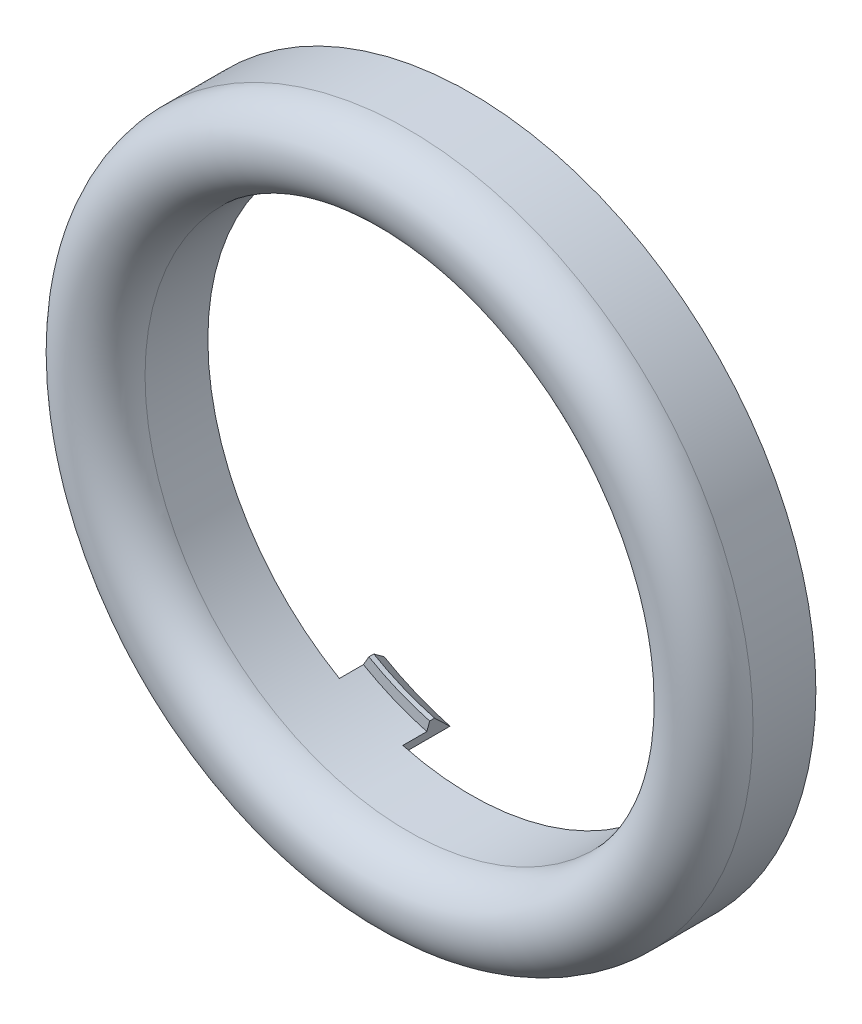
ISO-10303-21;
HEADER;
FILE_DESCRIPTION(('STEP AP214'),'2;1');
FILE_NAME('part.step','',(''),(''),'','','');
FILE_SCHEMA(('AUTOMOTIVE_DESIGN { 1 0 10303 214 1 1 1 1 }'));
ENDSEC;
DATA;
#1=APPLICATION_CONTEXT('core data for automotive mechanical design processes');
#2=APPLICATION_PROTOCOL_DEFINITION('international standard','automotive_design',2000,#1);
#3=PRODUCT_CONTEXT('',#1,'mechanical');
#4=PRODUCT('Part','Part','',(#3));
#5=PRODUCT_RELATED_PRODUCT_CATEGORY('part','',(#4));
#6=PRODUCT_DEFINITION_FORMATION('','',#4);
#7=PRODUCT_DEFINITION_CONTEXT('part definition',#1,'design');
#8=PRODUCT_DEFINITION('design','',#6,#7);
#9=PRODUCT_DEFINITION_SHAPE('','',#8);
#10=(LENGTH_UNIT() NAMED_UNIT(*) SI_UNIT(.MILLI.,.METRE.));
#11=(NAMED_UNIT(*) PLANE_ANGLE_UNIT() SI_UNIT($,.RADIAN.));
#12=(NAMED_UNIT(*) SI_UNIT($,.STERADIAN.) SOLID_ANGLE_UNIT());
#13=UNCERTAINTY_MEASURE_WITH_UNIT(LENGTH_MEASURE(1.E-05),#10,'distance_accuracy_value','');
#14=(GEOMETRIC_REPRESENTATION_CONTEXT(3) GLOBAL_UNCERTAINTY_ASSIGNED_CONTEXT((#13)) GLOBAL_UNIT_ASSIGNED_CONTEXT((#10,
#11,#12)) REPRESENTATION_CONTEXT('',''));
#15=CARTESIAN_POINT('',(0.,0.,0.));
#16=DIRECTION('',(0.,0.,1.));
#17=DIRECTION('',(1.,0.,0.));
#18=AXIS2_PLACEMENT_3D('',#15,#16,#17);
#19=CARTESIAN_POINT('',(-31.575,0.,0.));
#20=DIRECTION('',(0.,0.,-1.));
#21=DIRECTION('',(-1.,0.,0.));
#22=AXIS2_PLACEMENT_3D('',#19,#20,#21);
#23=PLANE('',#22);
#24=CARTESIAN_POINT('',(0.,0.,0.));
#25=DIRECTION('',(0.,0.,-1.));
#26=DIRECTION('',(-1.,0.,0.));
#27=AXIS2_PLACEMENT_3D('',#24,#25,#26);
#28=CIRCLE('',#27,31.575);
#29=CARTESIAN_POINT('',(-31.575,0.,0.));
#30=VERTEX_POINT('',#29);
#31=EDGE_CURVE('E11',#30,#30,#28,.T.);
#32=ORIENTED_EDGE('',*,*,#31,.T.);
#33=EDGE_LOOP('',(#32));
#34=FACE_BOUND('',#33,.T.);
#35=CARTESIAN_POINT('',(0.,0.,0.));
#36=DIRECTION('',(0.,0.,-1.));
#37=DIRECTION('',(-1.,0.,0.));
#38=AXIS2_PLACEMENT_3D('',#35,#36,#37);
#39=CIRCLE('',#38,24.075);
#40=CARTESIAN_POINT('',(24.075,0.,0.));
#41=VERTEX_POINT('',#40);
#42=CARTESIAN_POINT('',(-6.23106851084296,-23.2546642679094,0.));
#43=VERTEX_POINT('',#42);
#44=EDGE_CURVE('E404',#41,#43,#39,.T.);
#45=ORIENTED_EDGE('',*,*,#44,.F.);
#46=DIRECTION('',(1.,0.,0.));
#47=VECTOR('',#46,1.);
#48=CARTESIAN_POINT('',(24.975,0.,0.));
#49=LINE('',#48,#47);
#50=CARTESIAN_POINT('',(24.975,0.,0.));
#51=VERTEX_POINT('',#50);
#52=EDGE_CURVE('E233',#41,#51,#49,.T.);
#53=ORIENTED_EDGE('',*,*,#52,.T.);
#54=CARTESIAN_POINT('',(0.,0.,0.));
#55=DIRECTION('',(0.,0.,-1.));
#56=DIRECTION('',(-1.,0.,0.));
#57=AXIS2_PLACEMENT_3D('',#54,#55,#56);
#58=CIRCLE('',#57,24.975);
#59=CARTESIAN_POINT('',(24.1239975115695,6.46400565143547,0.));
#60=VERTEX_POINT('',#59);
#61=EDGE_CURVE('E223',#60,#51,#58,.T.);
#62=ORIENTED_EDGE('',*,*,#61,.F.);
#63=DIRECTION('',(0.965925826289068,0.258819045102521,0.));
#64=VECTOR('',#63,1.);
#65=CARTESIAN_POINT('',(24.1239975115695,6.46400565143547,0.));
#66=LINE('',#65,#64);
#67=CARTESIAN_POINT('',(23.2546642679093,6.2310685108432,0.));
#68=VERTEX_POINT('',#67);
#69=EDGE_CURVE('E261',#68,#60,#66,.T.);
#70=ORIENTED_EDGE('',*,*,#69,.F.);
#71=CARTESIAN_POINT('',(-12.0375000000001,20.8495615961103,0.));
#72=VERTEX_POINT('',#71);
#73=EDGE_CURVE('E409',#72,#68,#39,.T.);
#74=ORIENTED_EDGE('',*,*,#73,.F.);
#75=DIRECTION('',(-0.500000000000004,0.866025403784436,0.));
#76=VECTOR('',#75,1.);
#77=CARTESIAN_POINT('',(-12.4875000000001,21.6289844595163,0.));
#78=LINE('',#77,#76);
#79=CARTESIAN_POINT('',(-12.4875000000001,21.6289844595163,0.));
#80=VERTEX_POINT('',#79);
#81=EDGE_CURVE('E290',#72,#80,#78,.T.);
#82=ORIENTED_EDGE('',*,*,#81,.T.);
#83=CARTESIAN_POINT('',(0.,0.,0.));
#84=DIRECTION('',(0.,0.,-1.));
#85=DIRECTION('',(0.500000000000004,-0.866025403784436,0.));
#86=AXIS2_PLACEMENT_3D('',#83,#84,#85);
#87=CIRCLE('',#86,24.975);
#88=CARTESIAN_POINT('',(-17.6599918601341,17.6599918601339,0.));
#89=VERTEX_POINT('',#88);
#90=EDGE_CURVE('E329',#89,#80,#87,.T.);
#91=ORIENTED_EDGE('',*,*,#90,.F.);
#92=DIRECTION('',(-0.707106781186551,0.707106781186544,0.));
#93=VECTOR('',#92,1.);
#94=CARTESIAN_POINT('',(-17.6599918601341,17.6599918601339,0.));
#95=LINE('',#94,#93);
#96=CARTESIAN_POINT('',(-17.0235957570662,17.023595757066,0.));
#97=VERTEX_POINT('',#96);
#98=EDGE_CURVE('E313',#97,#89,#95,.T.);
#99=ORIENTED_EDGE('',*,*,#98,.F.);
#100=CARTESIAN_POINT('',(-12.0374999999998,-20.8495615961105,0.));
#101=VERTEX_POINT('',#100);
#102=EDGE_CURVE('E405',#101,#97,#39,.T.);
#103=ORIENTED_EDGE('',*,*,#102,.F.);
#104=DIRECTION('',(-0.499999999999992,-0.866025403784443,0.));
#105=VECTOR('',#104,1.);
#106=CARTESIAN_POINT('',(-12.4874999999998,-21.6289844595165,0.));
#107=LINE('',#106,#105);
#108=CARTESIAN_POINT('',(-12.4874999999998,-21.6289844595165,0.));
#109=VERTEX_POINT('',#108);
#110=EDGE_CURVE('E349',#101,#109,#107,.T.);
#111=ORIENTED_EDGE('',*,*,#110,.T.);
#112=CARTESIAN_POINT('',(0.,0.,0.));
#113=DIRECTION('',(0.,0.,-1.));
#114=DIRECTION('',(0.499999999999992,0.866025403784443,0.));
#115=AXIS2_PLACEMENT_3D('',#112,#113,#114);
#116=CIRCLE('',#115,24.975);
#117=CARTESIAN_POINT('',(-6.46400565143522,-24.1239975115695,0.));
#118=VERTEX_POINT('',#117);
#119=EDGE_CURVE('E391',#118,#109,#116,.T.);
#120=ORIENTED_EDGE('',*,*,#119,.F.);
#121=DIRECTION('',(-0.258819045102511,-0.965925826289071,0.));
#122=VECTOR('',#121,1.);
#123=CARTESIAN_POINT('',(-6.46400565143522,-24.1239975115695,0.));
#124=LINE('',#123,#122);
#125=EDGE_CURVE('E372',#43,#118,#124,.T.);
#126=ORIENTED_EDGE('',*,*,#125,.F.);
#127=EDGE_LOOP('',(#45,#53,#62,#70,#74,#82,#91,#99,#103,#111,#120,#126));
#128=FACE_BOUND('',#127,.T.);
#129=ADVANCED_FACE('F49',(#34,#128),#23,.T.);
#130=CARTESIAN_POINT('',(0.,0.,0.));
#131=DIRECTION('',(0.,0.,-1.));
#132=DIRECTION('',(-1.,0.,0.));
#133=AXIS2_PLACEMENT_3D('',#130,#131,#132);
#134=CYLINDRICAL_SURFACE('',#133,31.575);
#135=CARTESIAN_POINT('',(0.,0.,5.75));
#136=DIRECTION('',(0.,0.,-1.));
#137=DIRECTION('',(-1.,0.,0.));
#138=AXIS2_PLACEMENT_3D('',#135,#136,#137);
#139=CIRCLE('',#138,31.575);
#140=CARTESIAN_POINT('',(-31.575,0.,5.75));
#141=VERTEX_POINT('',#140);
#142=EDGE_CURVE('E57',#141,#141,#139,.T.);
#143=ORIENTED_EDGE('',*,*,#142,.T.);
#144=EDGE_LOOP('',(#143));
#145=FACE_BOUND('',#144,.T.);
#146=ORIENTED_EDGE('',*,*,#31,.F.);
#147=EDGE_LOOP('',(#146));
#148=FACE_BOUND('',#147,.T.);
#149=ADVANCED_FACE('F416',(#145,#148),#134,.T.);
#150=CARTESIAN_POINT('',(0.,0.,5.75));
#151=DIRECTION('',(0.,0.,-1.));
#152=DIRECTION('',(-1.,0.,0.));
#153=AXIS2_PLACEMENT_3D('',#150,#151,#152);
#154=TOROIDAL_SURFACE('',#153,27.825,3.75);
#155=CARTESIAN_POINT('',(0.,0.,5.75));
#156=DIRECTION('',(0.,0.,-1.));
#157=DIRECTION('',(-1.,0.,0.));
#158=AXIS2_PLACEMENT_3D('',#155,#156,#157);
#159=CIRCLE('',#158,24.075);
#160=CARTESIAN_POINT('',(-24.075,0.,5.75));
#161=VERTEX_POINT('',#160);
#162=EDGE_CURVE('E408',#161,#161,#159,.T.);
#163=ORIENTED_EDGE('',*,*,#162,.T.);
#164=EDGE_LOOP('',(#163));
#165=FACE_BOUND('',#164,.T.);
#166=ORIENTED_EDGE('',*,*,#142,.F.);
#167=EDGE_LOOP('',(#166));
#168=FACE_BOUND('',#167,.T.);
#169=ADVANCED_FACE('F419',(#165,#168),#154,.T.);
#170=CARTESIAN_POINT('',(0.,0.,0.));
#171=DIRECTION('',(0.,0.,-1.));
#172=DIRECTION('',(-1.,0.,0.));
#173=AXIS2_PLACEMENT_3D('',#170,#171,#172);
#174=CYLINDRICAL_SURFACE('',#173,24.075);
#175=ORIENTED_EDGE('',*,*,#102,.T.);
#176=DIRECTION('',(0.,0.,1.));
#177=VECTOR('',#176,1.);
#178=CARTESIAN_POINT('',(-17.0235957570662,17.023595757066,-2.2));
#179=LINE('',#178,#177);
#180=CARTESIAN_POINT('',(-17.0235957570662,17.023595757066,-2.2));
#181=VERTEX_POINT('',#180);
#182=EDGE_CURVE('E310',#181,#97,#179,.T.);
#183=ORIENTED_EDGE('',*,*,#182,.F.);
#184=CARTESIAN_POINT('',(0.,0.,-2.2));
#185=DIRECTION('',(0.,0.,-1.));
#186=DIRECTION('',(0.500000000000004,-0.866025403784436,0.));
#187=AXIS2_PLACEMENT_3D('',#184,#185,#186);
#188=CIRCLE('',#187,24.075);
#189=CARTESIAN_POINT('',(-12.0375000000001,20.8495615961103,-2.2));
#190=VERTEX_POINT('',#189);
#191=EDGE_CURVE('E326',#181,#190,#188,.T.);
#192=ORIENTED_EDGE('',*,*,#191,.T.);
#193=DIRECTION('',(0.,0.,1.));
#194=VECTOR('',#193,1.);
#195=CARTESIAN_POINT('',(-12.0375000000001,20.8495615961103,-2.2));
#196=LINE('',#195,#194);
#197=EDGE_CURVE('E287',#190,#72,#196,.T.);
#198=ORIENTED_EDGE('',*,*,#197,.T.);
#199=ORIENTED_EDGE('',*,*,#73,.T.);
#200=DIRECTION('',(0.,0.,1.));
#201=VECTOR('',#200,1.);
#202=CARTESIAN_POINT('',(23.2546642679093,6.2310685108432,-2.2));
#203=LINE('',#202,#201);
#204=CARTESIAN_POINT('',(23.2546642679093,6.2310685108432,-2.2));
#205=VERTEX_POINT('',#204);
#206=EDGE_CURVE('E217',#205,#68,#203,.T.);
#207=ORIENTED_EDGE('',*,*,#206,.F.);
#208=CARTESIAN_POINT('',(0.,0.,-2.2));
#209=DIRECTION('',(0.,0.,-1.));
#210=DIRECTION('',(-1.,0.,0.));
#211=AXIS2_PLACEMENT_3D('',#208,#209,#210);
#212=CIRCLE('',#211,24.075);
#213=CARTESIAN_POINT('',(24.075,0.,-2.2));
#214=VERTEX_POINT('',#213);
#215=EDGE_CURVE('E209',#205,#214,#212,.T.);
#216=ORIENTED_EDGE('',*,*,#215,.T.);
#217=DIRECTION('',(0.,0.,1.));
#218=VECTOR('',#217,1.);
#219=CARTESIAN_POINT('',(24.075,0.,-2.2));
#220=LINE('',#219,#218);
#221=EDGE_CURVE('E214',#214,#41,#220,.T.);
#222=ORIENTED_EDGE('',*,*,#221,.T.);
#223=ORIENTED_EDGE('',*,*,#44,.T.);
#224=DIRECTION('',(0.,0.,1.));
#225=VECTOR('',#224,1.);
#226=CARTESIAN_POINT('',(-6.23106851084296,-23.2546642679094,-2.2));
#227=LINE('',#226,#225);
#228=CARTESIAN_POINT('',(-6.23106851084296,-23.2546642679094,-2.2));
#229=VERTEX_POINT('',#228);
#230=EDGE_CURVE('E368',#229,#43,#227,.T.);
#231=ORIENTED_EDGE('',*,*,#230,.F.);
#232=CARTESIAN_POINT('',(0.,0.,-2.2));
#233=DIRECTION('',(0.,0.,-1.));
#234=DIRECTION('',(0.499999999999992,0.866025403784443,0.));
#235=AXIS2_PLACEMENT_3D('',#232,#233,#234);
#236=CIRCLE('',#235,24.075);
#237=CARTESIAN_POINT('',(-12.0374999999998,-20.8495615961105,-2.2));
#238=VERTEX_POINT('',#237);
#239=EDGE_CURVE('E388',#229,#238,#236,.T.);
#240=ORIENTED_EDGE('',*,*,#239,.T.);
#241=DIRECTION('',(0.,0.,1.));
#242=VECTOR('',#241,1.);
#243=CARTESIAN_POINT('',(-12.0374999999998,-20.8495615961105,-2.2));
#244=LINE('',#243,#242);
#245=EDGE_CURVE('E345',#238,#101,#244,.T.);
#246=ORIENTED_EDGE('',*,*,#245,.T.);
#247=EDGE_LOOP('',(#175,#183,#192,#198,#199,#207,#216,#222,#223,#231,#240,#246));
#248=FACE_BOUND('',#247,.T.);
#249=ORIENTED_EDGE('',*,*,#162,.F.);
#250=EDGE_LOOP('',(#249));
#251=FACE_BOUND('',#250,.T.);
#252=ADVANCED_FACE('F212',(#248,#251),#174,.F.);
#253=CARTESIAN_POINT('',(-6.23106851084296,-23.2546642679094,-2.2));
#254=DIRECTION('',(0.,0.,-1.));
#255=DIRECTION('',(0.499999999999992,0.866025403784443,0.));
#256=AXIS2_PLACEMENT_3D('',#253,#254,#255);
#257=PLANE('',#256);
#258=CARTESIAN_POINT('',(0.,0.,-2.20000000000001));
#259=DIRECTION('',(0.,0.,-1.));
#260=DIRECTION('',(0.499999999999992,0.866025403784443,0.));
#261=AXIS2_PLACEMENT_3D('',#258,#259,#260);
#262=CIRCLE('',#261,23.075);
#263=CARTESIAN_POINT('',(-5.97224946574045,-22.2887384416203,-2.20000000000001));
#264=VERTEX_POINT('',#263);
#265=CARTESIAN_POINT('',(-11.5374999999998,-19.983536192326,-2.20000000000001));
#266=VERTEX_POINT('',#265);
#267=EDGE_CURVE('E401',#264,#266,#262,.T.);
#268=ORIENTED_EDGE('',*,*,#267,.T.);
#269=DIRECTION('',(-0.499999999999992,-0.866025403784443,0.));
#270=VECTOR('',#269,1.);
#271=CARTESIAN_POINT('',(-12.0374999999998,-20.8495615961105,-2.2));
#272=LINE('',#271,#270);
#273=EDGE_CURVE('E341',#266,#238,#272,.T.);
#274=ORIENTED_EDGE('',*,*,#273,.T.);
#275=ORIENTED_EDGE('',*,*,#239,.F.);
#276=DIRECTION('',(-0.258819045102511,-0.965925826289071,0.));
#277=VECTOR('',#276,1.);
#278=CARTESIAN_POINT('',(-6.23106851084296,-23.2546642679094,-2.2));
#279=LINE('',#278,#277);
#280=EDGE_CURVE('E364',#264,#229,#279,.T.);
#281=ORIENTED_EDGE('',*,*,#280,.F.);
#282=EDGE_LOOP('',(#268,#274,#275,#281));
#283=FACE_BOUND('',#282,.T.);
#284=ADVANCED_FACE('F427',(#283),#257,.F.);
#285=CARTESIAN_POINT('',(0.,0.,0.));
#286=DIRECTION('',(0.,0.,-1.));
#287=DIRECTION('',(0.499999999999992,0.866025403784443,0.));
#288=AXIS2_PLACEMENT_3D('',#285,#286,#287);
#289=CYLINDRICAL_SURFACE('',#288,23.075);
#290=CARTESIAN_POINT('',(0.,0.,-2.64999999999998));
#291=DIRECTION('',(0.,0.,-1.));
#292=DIRECTION('',(0.499999999999992,0.866025403784443,0.));
#293=AXIS2_PLACEMENT_3D('',#290,#291,#292);
#294=CIRCLE('',#293,23.075);
#295=CARTESIAN_POINT('',(-5.97224946574045,-22.2887384416203,-2.64999999999998));
#296=VERTEX_POINT('',#295);
#297=CARTESIAN_POINT('',(-11.5374999999998,-19.983536192326,-2.64999999999998));
#298=VERTEX_POINT('',#297);
#299=EDGE_CURVE('E398',#296,#298,#294,.T.);
#300=ORIENTED_EDGE('',*,*,#299,.T.);
#301=DIRECTION('',(0.,0.,1.));
#302=VECTOR('',#301,1.);
#303=CARTESIAN_POINT('',(-11.5374999999998,-19.983536192326,-2.20000000000001));
#304=LINE('',#303,#302);
#305=EDGE_CURVE('E360',#298,#266,#304,.T.);
#306=ORIENTED_EDGE('',*,*,#305,.T.);
#307=ORIENTED_EDGE('',*,*,#267,.F.);
#308=DIRECTION('',(0.,0.,1.));
#309=VECTOR('',#308,1.);
#310=CARTESIAN_POINT('',(-5.97224946574045,-22.2887384416203,-2.20000000000001));
#311=LINE('',#310,#309);
#312=EDGE_CURVE('E384',#296,#264,#311,.T.);
#313=ORIENTED_EDGE('',*,*,#312,.F.);
#314=EDGE_LOOP('',(#300,#306,#307,#313));
#315=FACE_BOUND('',#314,.T.);
#316=ADVANCED_FACE('F501',(#315),#289,.F.);
#317=CARTESIAN_POINT('',(0.,0.,-4.55));
#318=DIRECTION('',(0.,0.,-1.));
#319=DIRECTION('',(0.499999999999992,0.866025403784443,0.));
#320=AXIS2_PLACEMENT_3D('',#317,#318,#319);
#321=CONICAL_SURFACE('',#320,24.975,0.785398163397442);
#322=CARTESIAN_POINT('',(0.,0.,-4.55));
#323=DIRECTION('',(0.,0.,-1.));
#324=DIRECTION('',(0.499999999999992,0.866025403784443,0.));
#325=AXIS2_PLACEMENT_3D('',#322,#323,#324);
#326=CIRCLE('',#325,24.975);
#327=CARTESIAN_POINT('',(-6.46400565143522,-24.1239975115695,-4.55));
#328=VERTEX_POINT('',#327);
#329=CARTESIAN_POINT('',(-12.4874999999998,-21.6289844595165,-4.55));
#330=VERTEX_POINT('',#329);
#331=EDGE_CURVE('E395',#328,#330,#326,.T.);
#332=ORIENTED_EDGE('',*,*,#331,.T.);
#333=DIRECTION('',(0.353553390593266,0.612372435695794,0.707106781186551));
#334=VECTOR('',#333,1.);
#335=CARTESIAN_POINT('',(-11.5374999999998,-19.983536192326,-2.64999999999998));
#336=LINE('',#335,#334);
#337=EDGE_CURVE('E356',#330,#298,#336,.T.);
#338=ORIENTED_EDGE('',*,*,#337,.T.);
#339=ORIENTED_EDGE('',*,*,#299,.F.);
#340=DIRECTION('',(0.183012701892212,0.683012701892217,0.707106781186551));
#341=VECTOR('',#340,1.);
#342=CARTESIAN_POINT('',(-5.97224946574045,-22.2887384416203,-2.64999999999998));
#343=LINE('',#342,#341);
#344=EDGE_CURVE('E380',#328,#296,#343,.T.);
#345=ORIENTED_EDGE('',*,*,#344,.F.);
#346=EDGE_LOOP('',(#332,#338,#339,#345));
#347=FACE_BOUND('',#346,.T.);
#348=ADVANCED_FACE('F505',(#347),#321,.F.);
#349=CARTESIAN_POINT('',(0.,0.,0.));
#350=DIRECTION('',(0.,0.,-1.));
#351=DIRECTION('',(0.499999999999992,0.866025403784443,0.));
#352=AXIS2_PLACEMENT_3D('',#349,#350,#351);
#353=CYLINDRICAL_SURFACE('',#352,24.975);
#354=ORIENTED_EDGE('',*,*,#119,.T.);
#355=DIRECTION('',(0.,0.,-1.));
#356=VECTOR('',#355,1.);
#357=CARTESIAN_POINT('',(-12.4874999999998,-21.6289844595165,-4.55));
#358=LINE('',#357,#356);
#359=EDGE_CURVE('E352',#109,#330,#358,.T.);
#360=ORIENTED_EDGE('',*,*,#359,.T.);
#361=ORIENTED_EDGE('',*,*,#331,.F.);
#362=DIRECTION('',(0.,0.,-1.));
#363=VECTOR('',#362,1.);
#364=CARTESIAN_POINT('',(-6.46400565143522,-24.1239975115695,-4.55));
#365=LINE('',#364,#363);
#366=EDGE_CURVE('E376',#118,#328,#365,.T.);
#367=ORIENTED_EDGE('',*,*,#366,.F.);
#368=EDGE_LOOP('',(#354,#360,#361,#367));
#369=FACE_BOUND('',#368,.T.);
#370=ADVANCED_FACE('F497',(#369),#353,.T.);
#371=CARTESIAN_POINT('',(0.,0.,0.));
#372=DIRECTION('',(-0.965925826289071,0.258819045102511,0.));
#373=DIRECTION('',(0.,0.,-1.));
#374=AXIS2_PLACEMENT_3D('',#371,#372,#373);
#375=PLANE('',#374);
#376=ORIENTED_EDGE('',*,*,#280,.T.);
#377=ORIENTED_EDGE('',*,*,#230,.T.);
#378=ORIENTED_EDGE('',*,*,#125,.T.);
#379=ORIENTED_EDGE('',*,*,#366,.T.);
#380=ORIENTED_EDGE('',*,*,#344,.T.);
#381=ORIENTED_EDGE('',*,*,#312,.T.);
#382=EDGE_LOOP('',(#376,#377,#378,#379,#380,#381));
#383=FACE_BOUND('',#382,.T.);
#384=ADVANCED_FACE('F493',(#383),#375,.F.);
#385=CARTESIAN_POINT('',(0.,0.,0.));
#386=DIRECTION('',(-0.866025403784443,0.499999999999992,0.));
#387=DIRECTION('',(0.,0.,-1.));
#388=AXIS2_PLACEMENT_3D('',#385,#386,#387);
#389=PLANE('',#388);
#390=ORIENTED_EDGE('',*,*,#273,.F.);
#391=ORIENTED_EDGE('',*,*,#305,.F.);
#392=ORIENTED_EDGE('',*,*,#337,.F.);
#393=ORIENTED_EDGE('',*,*,#359,.F.);
#394=ORIENTED_EDGE('',*,*,#110,.F.);
#395=ORIENTED_EDGE('',*,*,#245,.F.);
#396=EDGE_LOOP('',(#390,#391,#392,#393,#394,#395));
#397=FACE_BOUND('',#396,.T.);
#398=ADVANCED_FACE('F480',(#397),#389,.T.);
#399=CARTESIAN_POINT('',(-17.0235957570662,17.023595757066,-2.2));
#400=DIRECTION('',(0.,0.,-1.));
#401=DIRECTION('',(0.500000000000004,-0.866025403784436,0.));
#402=AXIS2_PLACEMENT_3D('',#399,#400,#401);
#403=PLANE('',#402);
#404=CARTESIAN_POINT('',(0.,0.,-2.20000000000001));
#405=DIRECTION('',(0.,0.,-1.));
#406=DIRECTION('',(0.500000000000004,-0.866025403784436,0.));
#407=AXIS2_PLACEMENT_3D('',#404,#405,#406);
#408=CIRCLE('',#407,23.075);
#409=CARTESIAN_POINT('',(-16.3164889758797,16.3164889758795,-2.20000000000001));
#410=VERTEX_POINT('',#409);
#411=CARTESIAN_POINT('',(-11.5375000000001,19.9835361923259,-2.20000000000001));
#412=VERTEX_POINT('',#411);
#413=EDGE_CURVE('E338',#410,#412,#408,.T.);
#414=ORIENTED_EDGE('',*,*,#413,.T.);
#415=DIRECTION('',(-0.500000000000004,0.866025403784436,0.));
#416=VECTOR('',#415,1.);
#417=CARTESIAN_POINT('',(-12.0375000000001,20.8495615961103,-2.2));
#418=LINE('',#417,#416);
#419=EDGE_CURVE('E283',#412,#190,#418,.T.);
#420=ORIENTED_EDGE('',*,*,#419,.T.);
#421=ORIENTED_EDGE('',*,*,#191,.F.);
#422=DIRECTION('',(-0.707106781186551,0.707106781186544,0.));
#423=VECTOR('',#422,1.);
#424=CARTESIAN_POINT('',(-17.0235957570662,17.023595757066,-2.2));
#425=LINE('',#424,#423);
#426=EDGE_CURVE('E306',#410,#181,#425,.T.);
#427=ORIENTED_EDGE('',*,*,#426,.F.);
#428=EDGE_LOOP('',(#414,#420,#421,#427));
#429=FACE_BOUND('',#428,.T.);
#430=ADVANCED_FACE('F476',(#429),#403,.F.);
#431=CARTESIAN_POINT('',(0.,0.,0.));
#432=DIRECTION('',(0.,0.,-1.));
#433=DIRECTION('',(0.500000000000004,-0.866025403784436,0.));
#434=AXIS2_PLACEMENT_3D('',#431,#432,#433);
#435=CYLINDRICAL_SURFACE('',#434,23.075);
#436=CARTESIAN_POINT('',(0.,0.,-2.64999999999998));
#437=DIRECTION('',(0.,0.,-1.));
#438=DIRECTION('',(0.500000000000004,-0.866025403784436,0.));
#439=AXIS2_PLACEMENT_3D('',#436,#437,#438);
#440=CIRCLE('',#439,23.075);
#441=CARTESIAN_POINT('',(-16.3164889758797,16.3164889758795,-2.64999999999998));
#442=VERTEX_POINT('',#441);
#443=CARTESIAN_POINT('',(-11.5375000000001,19.9835361923259,-2.64999999999998));
#444=VERTEX_POINT('',#443);
#445=EDGE_CURVE('E335',#442,#444,#440,.T.);
#446=ORIENTED_EDGE('',*,*,#445,.T.);
#447=DIRECTION('',(0.,0.,1.));
#448=VECTOR('',#447,1.);
#449=CARTESIAN_POINT('',(-11.5375000000001,19.9835361923259,-2.20000000000001));
#450=LINE('',#449,#448);
#451=EDGE_CURVE('E302',#444,#412,#450,.T.);
#452=ORIENTED_EDGE('',*,*,#451,.T.);
#453=ORIENTED_EDGE('',*,*,#413,.F.);
#454=DIRECTION('',(0.,0.,1.));
#455=VECTOR('',#454,1.);
#456=CARTESIAN_POINT('',(-16.3164889758797,16.3164889758795,-2.20000000000001));
#457=LINE('',#456,#455);
#458=EDGE_CURVE('E322',#442,#410,#457,.T.);
#459=ORIENTED_EDGE('',*,*,#458,.F.);
#460=EDGE_LOOP('',(#446,#452,#453,#459));
#461=FACE_BOUND('',#460,.T.);
#462=ADVANCED_FACE('F479',(#461),#435,.F.);
#463=CARTESIAN_POINT('',(0.,0.,-4.55));
#464=DIRECTION('',(0.,0.,-1.));
#465=DIRECTION('',(0.500000000000004,-0.866025403784436,0.));
#466=AXIS2_PLACEMENT_3D('',#463,#464,#465);
#467=CONICAL_SURFACE('',#466,24.975,0.785398163397442);
#468=CARTESIAN_POINT('',(0.,0.,-4.55));
#469=DIRECTION('',(0.,0.,-1.));
#470=DIRECTION('',(0.500000000000004,-0.866025403784436,0.));
#471=AXIS2_PLACEMENT_3D('',#468,#469,#470);
#472=CIRCLE('',#471,24.975);
#473=CARTESIAN_POINT('',(-17.6599918601341,17.6599918601339,-4.55));
#474=VERTEX_POINT('',#473);
#475=CARTESIAN_POINT('',(-12.4875000000001,21.6289844595163,-4.55));
#476=VERTEX_POINT('',#475);
#477=EDGE_CURVE('E332',#474,#476,#472,.T.);
#478=ORIENTED_EDGE('',*,*,#477,.T.);
#479=DIRECTION('',(0.353553390593275,-0.61237243569579,0.707106781186551));
#480=VECTOR('',#479,1.);
#481=CARTESIAN_POINT('',(-11.5375000000001,19.9835361923259,-2.64999999999998));
#482=LINE('',#481,#480);
#483=EDGE_CURVE('E298',#476,#444,#482,.T.);
#484=ORIENTED_EDGE('',*,*,#483,.T.);
#485=ORIENTED_EDGE('',*,*,#445,.F.);
#486=DIRECTION('',(0.5,-0.499999999999995,0.707106781186551));
#487=VECTOR('',#486,1.);
#488=CARTESIAN_POINT('',(-16.3164889758797,16.3164889758795,-2.64999999999998));
#489=LINE('',#488,#487);
#490=EDGE_CURVE('E318',#474,#442,#489,.T.);
#491=ORIENTED_EDGE('',*,*,#490,.F.);
#492=EDGE_LOOP('',(#478,#484,#485,#491));
#493=FACE_BOUND('',#492,.T.);
#494=ADVANCED_FACE('F484',(#493),#467,.F.);
#495=CARTESIAN_POINT('',(0.,0.,0.));
#496=DIRECTION('',(0.,0.,-1.));
#497=DIRECTION('',(0.500000000000004,-0.866025403784436,0.));
#498=AXIS2_PLACEMENT_3D('',#495,#496,#497);
#499=CYLINDRICAL_SURFACE('',#498,24.975);
#500=ORIENTED_EDGE('',*,*,#90,.T.);
#501=DIRECTION('',(0.,0.,-1.));
#502=VECTOR('',#501,1.);
#503=CARTESIAN_POINT('',(-12.4875000000001,21.6289844595163,-4.55));
#504=LINE('',#503,#502);
#505=EDGE_CURVE('E294',#80,#476,#504,.T.);
#506=ORIENTED_EDGE('',*,*,#505,.T.);
#507=ORIENTED_EDGE('',*,*,#477,.F.);
#508=DIRECTION('',(0.,0.,-1.));
#509=VECTOR('',#508,1.);
#510=CARTESIAN_POINT('',(-17.6599918601341,17.6599918601339,-4.55));
#511=LINE('',#510,#509);
#512=EDGE_CURVE('E78',#89,#474,#511,.T.);
#513=ORIENTED_EDGE('',*,*,#512,.F.);
#514=EDGE_LOOP('',(#500,#506,#507,#513));
#515=FACE_BOUND('',#514,.T.);
#516=ADVANCED_FACE('F474',(#515),#499,.T.);
#517=CARTESIAN_POINT('',(0.,0.,0.));
#518=DIRECTION('',(0.707106781186544,0.707106781186551,0.));
#519=DIRECTION('',(0.,0.,-1.));
#520=AXIS2_PLACEMENT_3D('',#517,#518,#519);
#521=PLANE('',#520);
#522=ORIENTED_EDGE('',*,*,#426,.T.);
#523=ORIENTED_EDGE('',*,*,#182,.T.);
#524=ORIENTED_EDGE('',*,*,#98,.T.);
#525=ORIENTED_EDGE('',*,*,#512,.T.);
#526=ORIENTED_EDGE('',*,*,#490,.T.);
#527=ORIENTED_EDGE('',*,*,#458,.T.);
#528=EDGE_LOOP('',(#522,#523,#524,#525,#526,#527));
#529=FACE_BOUND('',#528,.T.);
#530=ADVANCED_FACE('F470',(#529),#521,.F.);
#531=CARTESIAN_POINT('',(0.,0.,0.));
#532=DIRECTION('',(0.866025403784436,0.500000000000004,0.));
#533=DIRECTION('',(0.,0.,-1.));
#534=AXIS2_PLACEMENT_3D('',#531,#532,#533);
#535=PLANE('',#534);
#536=ORIENTED_EDGE('',*,*,#419,.F.);
#537=ORIENTED_EDGE('',*,*,#451,.F.);
#538=ORIENTED_EDGE('',*,*,#483,.F.);
#539=ORIENTED_EDGE('',*,*,#505,.F.);
#540=ORIENTED_EDGE('',*,*,#81,.F.);
#541=ORIENTED_EDGE('',*,*,#197,.F.);
#542=EDGE_LOOP('',(#536,#537,#538,#539,#540,#541));
#543=FACE_BOUND('',#542,.T.);
#544=ADVANCED_FACE('F467',(#543),#535,.T.);
#545=CARTESIAN_POINT('',(23.2546642679093,6.2310685108432,-2.2));
#546=DIRECTION('',(0.,0.,-1.));
#547=DIRECTION('',(-1.,0.,0.));
#548=AXIS2_PLACEMENT_3D('',#545,#546,#547);
#549=PLANE('',#548);
#550=CARTESIAN_POINT('',(0.,0.,-2.20000000000001));
#551=DIRECTION('',(0.,0.,-1.));
#552=DIRECTION('',(-1.,0.,0.));
#553=AXIS2_PLACEMENT_3D('',#550,#551,#552);
#554=CIRCLE('',#553,23.075);
#555=CARTESIAN_POINT('',(22.2887384416202,5.97224946574068,-2.20000000000001));
#556=VERTEX_POINT('',#555);
#557=CARTESIAN_POINT('',(23.075,0.,-2.20000000000001));
#558=VERTEX_POINT('',#557);
#559=EDGE_CURVE('E238',#556,#558,#554,.T.);
#560=ORIENTED_EDGE('',*,*,#559,.T.);
#561=DIRECTION('',(1.,0.,0.));
#562=VECTOR('',#561,1.);
#563=CARTESIAN_POINT('',(24.075,0.,-2.2));
#564=LINE('',#563,#562);
#565=EDGE_CURVE('E230',#558,#214,#564,.T.);
#566=ORIENTED_EDGE('',*,*,#565,.T.);
#567=ORIENTED_EDGE('',*,*,#215,.F.);
#568=DIRECTION('',(0.965925826289068,0.258819045102521,0.));
#569=VECTOR('',#568,1.);
#570=CARTESIAN_POINT('',(23.2546642679093,6.2310685108432,-2.2));
#571=LINE('',#570,#569);
#572=EDGE_CURVE('E256',#556,#205,#571,.T.);
#573=ORIENTED_EDGE('',*,*,#572,.F.);
#574=EDGE_LOOP('',(#560,#566,#567,#573));
#575=FACE_BOUND('',#574,.T.);
#576=ADVANCED_FACE('F237',(#575),#549,.F.);
#577=CARTESIAN_POINT('',(0.,0.,0.));
#578=DIRECTION('',(0.,0.,-1.));
#579=DIRECTION('',(-1.,0.,0.));
#580=AXIS2_PLACEMENT_3D('',#577,#578,#579);
#581=CYLINDRICAL_SURFACE('',#580,23.075);
#582=CARTESIAN_POINT('',(0.,0.,-2.64999999999998));
#583=DIRECTION('',(0.,0.,-1.));
#584=DIRECTION('',(-1.,0.,0.));
#585=AXIS2_PLACEMENT_3D('',#582,#583,#584);
#586=CIRCLE('',#585,23.075);
#587=CARTESIAN_POINT('',(22.2887384416202,5.97224946574068,-2.64999999999998));
#588=VERTEX_POINT('',#587);
#589=CARTESIAN_POINT('',(23.075,0.,-2.64999999999998));
#590=VERTEX_POINT('',#589);
#591=EDGE_CURVE('E278',#588,#590,#586,.T.);
#592=ORIENTED_EDGE('',*,*,#591,.T.);
#593=DIRECTION('',(0.,0.,1.));
#594=VECTOR('',#593,1.);
#595=CARTESIAN_POINT('',(23.075,0.,-2.20000000000001));
#596=LINE('',#595,#594);
#597=EDGE_CURVE('E253',#590,#558,#596,.T.);
#598=ORIENTED_EDGE('',*,*,#597,.T.);
#599=ORIENTED_EDGE('',*,*,#559,.F.);
#600=DIRECTION('',(0.,0.,1.));
#601=VECTOR('',#600,1.);
#602=CARTESIAN_POINT('',(22.2887384416202,5.97224946574068,-2.20000000000001));
#603=LINE('',#602,#601);
#604=EDGE_CURVE('E224',#588,#556,#603,.T.);
#605=ORIENTED_EDGE('',*,*,#604,.F.);
#606=EDGE_LOOP('',(#592,#598,#599,#605));
#607=FACE_BOUND('',#606,.T.);
#608=ADVANCED_FACE('F450',(#607),#581,.F.);
#609=CARTESIAN_POINT('',(0.,0.,-4.55));
#610=DIRECTION('',(0.,0.,-1.));
#611=DIRECTION('',(-1.,0.,0.));
#612=AXIS2_PLACEMENT_3D('',#609,#610,#611);
#613=CONICAL_SURFACE('',#612,24.975,0.785398163397442);
#614=CARTESIAN_POINT('',(0.,0.,-4.55));
#615=DIRECTION('',(0.,0.,-1.));
#616=DIRECTION('',(-1.,0.,0.));
#617=AXIS2_PLACEMENT_3D('',#614,#615,#616);
#618=CIRCLE('',#617,24.975);
#619=CARTESIAN_POINT('',(24.1239975115695,6.46400565143547,-4.55));
#620=VERTEX_POINT('',#619);
#621=CARTESIAN_POINT('',(24.975,0.,-4.55));
#622=VERTEX_POINT('',#621);
#623=EDGE_CURVE('E275',#620,#622,#618,.T.);
#624=ORIENTED_EDGE('',*,*,#623,.T.);
#625=DIRECTION('',(-0.707106781186544,0.,0.707106781186551));
#626=VECTOR('',#625,1.);
#627=CARTESIAN_POINT('',(23.075,0.,-2.64999999999998));
#628=LINE('',#627,#626);
#629=EDGE_CURVE('E249',#622,#590,#628,.T.);
#630=ORIENTED_EDGE('',*,*,#629,.T.);
#631=ORIENTED_EDGE('',*,*,#591,.F.);
#632=DIRECTION('',(-0.683012701892215,-0.183012701892219,0.707106781186551));
#633=VECTOR('',#632,1.);
#634=CARTESIAN_POINT('',(22.2887384416202,5.97224946574068,-2.64999999999998));
#635=LINE('',#634,#633);
#636=EDGE_CURVE('E266',#620,#588,#635,.T.);
#637=ORIENTED_EDGE('',*,*,#636,.F.);
#638=EDGE_LOOP('',(#624,#630,#631,#637));
#639=FACE_BOUND('',#638,.T.);
#640=ADVANCED_FACE('F453',(#639),#613,.F.);
#641=CARTESIAN_POINT('',(0.,0.,0.));
#642=DIRECTION('',(0.,0.,-1.));
#643=DIRECTION('',(-1.,0.,0.));
#644=AXIS2_PLACEMENT_3D('',#641,#642,#643);
#645=CYLINDRICAL_SURFACE('',#644,24.975);
#646=ORIENTED_EDGE('',*,*,#61,.T.);
#647=DIRECTION('',(0.,0.,-1.));
#648=VECTOR('',#647,1.);
#649=CARTESIAN_POINT('',(24.975,0.,-4.55));
#650=LINE('',#649,#648);
#651=EDGE_CURVE('E245',#51,#622,#650,.T.);
#652=ORIENTED_EDGE('',*,*,#651,.T.);
#653=ORIENTED_EDGE('',*,*,#623,.F.);
#654=DIRECTION('',(0.,0.,-1.));
#655=VECTOR('',#654,1.);
#656=CARTESIAN_POINT('',(24.1239975115695,6.46400565143547,-4.55));
#657=LINE('',#656,#655);
#658=EDGE_CURVE('E67',#60,#620,#657,.T.);
#659=ORIENTED_EDGE('',*,*,#658,.F.);
#660=EDGE_LOOP('',(#646,#652,#653,#659));
#661=FACE_BOUND('',#660,.T.);
#662=ADVANCED_FACE('F454',(#661),#645,.T.);
#663=CARTESIAN_POINT('',(0.,0.,0.));
#664=DIRECTION('',(0.258819045102521,-0.965925826289068,0.));
#665=DIRECTION('',(0.,0.,-1.));
#666=AXIS2_PLACEMENT_3D('',#663,#664,#665);
#667=PLANE('',#666);
#668=ORIENTED_EDGE('',*,*,#572,.T.);
#669=ORIENTED_EDGE('',*,*,#206,.T.);
#670=ORIENTED_EDGE('',*,*,#69,.T.);
#671=ORIENTED_EDGE('',*,*,#658,.T.);
#672=ORIENTED_EDGE('',*,*,#636,.T.);
#673=ORIENTED_EDGE('',*,*,#604,.T.);
#674=EDGE_LOOP('',(#668,#669,#670,#671,#672,#673));
#675=FACE_BOUND('',#674,.T.);
#676=ADVANCED_FACE('F446',(#675),#667,.F.);
#677=CARTESIAN_POINT('',(0.,0.,0.));
#678=DIRECTION('',(0.,-1.,0.));
#679=DIRECTION('',(0.,0.,-1.));
#680=AXIS2_PLACEMENT_3D('',#677,#678,#679);
#681=PLANE('',#680);
#682=ORIENTED_EDGE('',*,*,#565,.F.);
#683=ORIENTED_EDGE('',*,*,#597,.F.);
#684=ORIENTED_EDGE('',*,*,#629,.F.);
#685=ORIENTED_EDGE('',*,*,#651,.F.);
#686=ORIENTED_EDGE('',*,*,#52,.F.);
#687=ORIENTED_EDGE('',*,*,#221,.F.);
#688=EDGE_LOOP('',(#682,#683,#684,#685,#686,#687));
#689=FACE_BOUND('',#688,.T.);
#690=ADVANCED_FACE('F228',(#689),#681,.T.);
#691=CLOSED_SHELL('',(#129,#149,#169,#252,#284,#316,#348,#370,#384,#398,#430,#462,#494,#516,
#530,#544,#576,#608,#640,#662,#676,#690));
#692=MANIFOLD_SOLID_BREP('B2',#691);
#693=ADVANCED_BREP_SHAPE_REPRESENTATION('',(#18,#692),#14);
#694=SHAPE_DEFINITION_REPRESENTATION(#9,#693);
ENDSEC;
END-ISO-10303-21;
